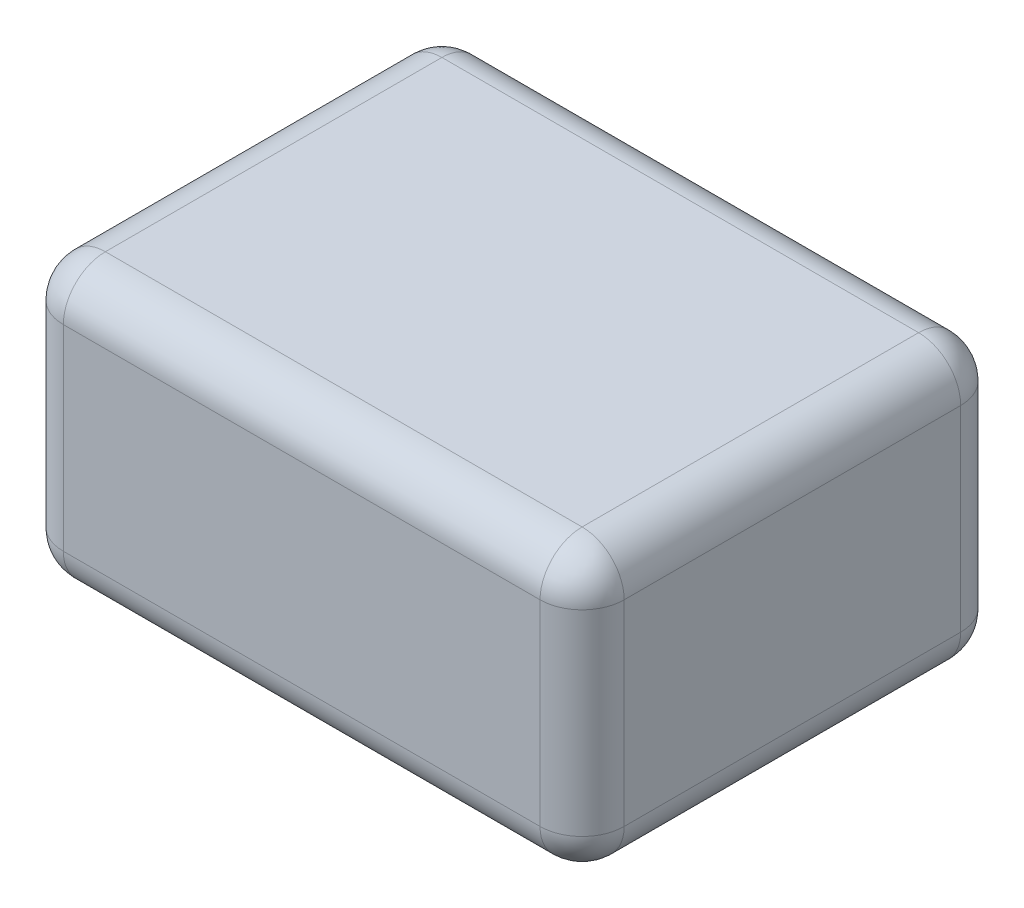
ISO-10303-21;
HEADER;
FILE_DESCRIPTION(('STEP AP214'),'2;1');
FILE_NAME('part.step','',(''),(''),'','','');
FILE_SCHEMA(('AUTOMOTIVE_DESIGN { 1 0 10303 214 1 1 1 1 }'));
ENDSEC;
DATA;
#1=APPLICATION_CONTEXT('core data for automotive mechanical design processes');
#2=APPLICATION_PROTOCOL_DEFINITION('international standard','automotive_design',2000,#1);
#3=PRODUCT_CONTEXT('',#1,'mechanical');
#4=PRODUCT('Part','Part','',(#3));
#5=PRODUCT_RELATED_PRODUCT_CATEGORY('part','',(#4));
#6=PRODUCT_DEFINITION_FORMATION('','',#4);
#7=PRODUCT_DEFINITION_CONTEXT('part definition',#1,'design');
#8=PRODUCT_DEFINITION('design','',#6,#7);
#9=PRODUCT_DEFINITION_SHAPE('','',#8);
#10=(LENGTH_UNIT() NAMED_UNIT(*) SI_UNIT(.MILLI.,.METRE.));
#11=(NAMED_UNIT(*) PLANE_ANGLE_UNIT() SI_UNIT($,.RADIAN.));
#12=(NAMED_UNIT(*) SI_UNIT($,.STERADIAN.) SOLID_ANGLE_UNIT());
#13=UNCERTAINTY_MEASURE_WITH_UNIT(LENGTH_MEASURE(1.E-05),#10,'distance_accuracy_value','');
#14=(GEOMETRIC_REPRESENTATION_CONTEXT(3) GLOBAL_UNCERTAINTY_ASSIGNED_CONTEXT((#13)) GLOBAL_UNIT_ASSIGNED_CONTEXT((#10,
#11,#12)) REPRESENTATION_CONTEXT('',''));
#15=CARTESIAN_POINT('',(0.,0.,0.));
#16=DIRECTION('',(0.,0.,1.));
#17=DIRECTION('',(1.,0.,0.));
#18=AXIS2_PLACEMENT_3D('',#15,#16,#17);
#19=CARTESIAN_POINT('',(-20.,20.,-15.));
#20=DIRECTION('',(1.,0.,0.));
#21=DIRECTION('',(0.,0.,-1.));
#22=AXIS2_PLACEMENT_3D('',#19,#20,#21);
#23=PLANE('',#22);
#24=DIRECTION('',(0.,0.,1.));
#25=VECTOR('',#24,1.);
#26=CARTESIAN_POINT('',(-20.,17.,-15.));
#27=LINE('',#26,#25);
#28=CARTESIAN_POINT('',(-20.,17.,12.));
#29=VERTEX_POINT('',#28);
#30=CARTESIAN_POINT('',(-20.,17.,-12.));
#31=VERTEX_POINT('',#30);
#32=EDGE_CURVE('E161',#29,#31,#27,.F.);
#33=ORIENTED_EDGE('',*,*,#32,.T.);
#34=DIRECTION('',(0.,-1.,0.));
#35=VECTOR('',#34,1.);
#36=CARTESIAN_POINT('',(-20.,20.,-12.));
#37=LINE('',#36,#35);
#38=CARTESIAN_POINT('',(-20.,3.,-12.));
#39=VERTEX_POINT('',#38);
#40=EDGE_CURVE('E164',#31,#39,#37,.T.);
#41=ORIENTED_EDGE('',*,*,#40,.T.);
#42=DIRECTION('',(0.,0.,1.));
#43=VECTOR('',#42,1.);
#44=CARTESIAN_POINT('',(-20.,3.,-15.));
#45=LINE('',#44,#43);
#46=CARTESIAN_POINT('',(-20.,3.,12.));
#47=VERTEX_POINT('',#46);
#48=EDGE_CURVE('E138',#39,#47,#45,.T.);
#49=ORIENTED_EDGE('',*,*,#48,.T.);
#50=DIRECTION('',(0.,-1.,0.));
#51=VECTOR('',#50,1.);
#52=CARTESIAN_POINT('',(-20.,20.,12.));
#53=LINE('',#52,#51);
#54=EDGE_CURVE('E156',#47,#29,#53,.F.);
#55=ORIENTED_EDGE('',*,*,#54,.T.);
#56=EDGE_LOOP('',(#33,#41,#49,#55));
#57=FACE_BOUND('',#56,.T.);
#58=ADVANCED_FACE('F41',(#57),#23,.F.);
#59=CARTESIAN_POINT('',(-20.,20.,15.));
#60=DIRECTION('',(0.,0.,-1.));
#61=DIRECTION('',(-1.,0.,0.));
#62=AXIS2_PLACEMENT_3D('',#59,#60,#61);
#63=PLANE('',#62);
#64=DIRECTION('',(1.,0.,0.));
#65=VECTOR('',#64,1.);
#66=CARTESIAN_POINT('',(-20.,3.,15.));
#67=LINE('',#66,#65);
#68=CARTESIAN_POINT('',(-17.,3.,15.));
#69=VERTEX_POINT('',#68);
#70=CARTESIAN_POINT('',(17.,3.,15.));
#71=VERTEX_POINT('',#70);
#72=EDGE_CURVE('E181',#69,#71,#67,.T.);
#73=ORIENTED_EDGE('',*,*,#72,.T.);
#74=DIRECTION('',(0.,-1.,0.));
#75=VECTOR('',#74,1.);
#76=CARTESIAN_POINT('',(17.,20.,15.));
#77=LINE('',#76,#75);
#78=CARTESIAN_POINT('',(17.,17.,15.));
#79=VERTEX_POINT('',#78);
#80=EDGE_CURVE('E184',#71,#79,#77,.F.);
#81=ORIENTED_EDGE('',*,*,#80,.T.);
#82=DIRECTION('',(1.,0.,0.));
#83=VECTOR('',#82,1.);
#84=CARTESIAN_POINT('',(-20.,17.,15.));
#85=LINE('',#84,#83);
#86=CARTESIAN_POINT('',(-17.,17.,15.));
#87=VERTEX_POINT('',#86);
#88=EDGE_CURVE('E179',#79,#87,#85,.F.);
#89=ORIENTED_EDGE('',*,*,#88,.T.);
#90=DIRECTION('',(0.,-1.,0.));
#91=VECTOR('',#90,1.);
#92=CARTESIAN_POINT('',(-17.,20.,15.));
#93=LINE('',#92,#91);
#94=EDGE_CURVE('E177',#87,#69,#93,.T.);
#95=ORIENTED_EDGE('',*,*,#94,.T.);
#96=EDGE_LOOP('',(#73,#81,#89,#95));
#97=FACE_BOUND('',#96,.T.);
#98=ADVANCED_FACE('F331',(#97),#63,.F.);
#99=CARTESIAN_POINT('',(20.,20.,15.));
#100=DIRECTION('',(-1.,0.,0.));
#101=DIRECTION('',(0.,0.,1.));
#102=AXIS2_PLACEMENT_3D('',#99,#100,#101);
#103=PLANE('',#102);
#104=DIRECTION('',(0.,0.,-1.));
#105=VECTOR('',#104,1.);
#106=CARTESIAN_POINT('',(20.,3.,15.));
#107=LINE('',#106,#105);
#108=CARTESIAN_POINT('',(20.,3.,12.));
#109=VERTEX_POINT('',#108);
#110=CARTESIAN_POINT('',(20.,3.,-12.));
#111=VERTEX_POINT('',#110);
#112=EDGE_CURVE('E190',#109,#111,#107,.T.);
#113=ORIENTED_EDGE('',*,*,#112,.T.);
#114=DIRECTION('',(0.,-1.,0.));
#115=VECTOR('',#114,1.);
#116=CARTESIAN_POINT('',(20.,20.,-12.));
#117=LINE('',#116,#115);
#118=CARTESIAN_POINT('',(20.,17.,-12.));
#119=VERTEX_POINT('',#118);
#120=EDGE_CURVE('E193',#111,#119,#117,.F.);
#121=ORIENTED_EDGE('',*,*,#120,.T.);
#122=DIRECTION('',(0.,0.,-1.));
#123=VECTOR('',#122,1.);
#124=CARTESIAN_POINT('',(20.,17.,15.));
#125=LINE('',#124,#123);
#126=CARTESIAN_POINT('',(20.,17.,12.));
#127=VERTEX_POINT('',#126);
#128=EDGE_CURVE('E188',#119,#127,#125,.F.);
#129=ORIENTED_EDGE('',*,*,#128,.T.);
#130=DIRECTION('',(0.,-1.,0.));
#131=VECTOR('',#130,1.);
#132=CARTESIAN_POINT('',(20.,20.,12.));
#133=LINE('',#132,#131);
#134=EDGE_CURVE('E186',#127,#109,#133,.T.);
#135=ORIENTED_EDGE('',*,*,#134,.T.);
#136=EDGE_LOOP('',(#113,#121,#129,#135));
#137=FACE_BOUND('',#136,.T.);
#138=ADVANCED_FACE('F301',(#137),#103,.F.);
#139=CARTESIAN_POINT('',(20.,20.,-15.));
#140=DIRECTION('',(0.,0.,1.));
#141=DIRECTION('',(1.,0.,0.));
#142=AXIS2_PLACEMENT_3D('',#139,#140,#141);
#143=PLANE('',#142);
#144=DIRECTION('',(-1.,0.,0.));
#145=VECTOR('',#144,1.);
#146=CARTESIAN_POINT('',(20.,3.,-15.));
#147=LINE('',#146,#145);
#148=CARTESIAN_POINT('',(17.,3.,-15.));
#149=VERTEX_POINT('',#148);
#150=CARTESIAN_POINT('',(-17.,3.,-15.));
#151=VERTEX_POINT('',#150);
#152=EDGE_CURVE('E199',#149,#151,#147,.T.);
#153=ORIENTED_EDGE('',*,*,#152,.T.);
#154=DIRECTION('',(0.,-1.,0.));
#155=VECTOR('',#154,1.);
#156=CARTESIAN_POINT('',(-17.,20.,-15.));
#157=LINE('',#156,#155);
#158=CARTESIAN_POINT('',(-17.,17.,-15.));
#159=VERTEX_POINT('',#158);
#160=EDGE_CURVE('E202',#151,#159,#157,.F.);
#161=ORIENTED_EDGE('',*,*,#160,.T.);
#162=DIRECTION('',(-1.,0.,0.));
#163=VECTOR('',#162,1.);
#164=CARTESIAN_POINT('',(20.,17.,-15.));
#165=LINE('',#164,#163);
#166=CARTESIAN_POINT('',(17.,17.,-15.));
#167=VERTEX_POINT('',#166);
#168=EDGE_CURVE('E197',#159,#167,#165,.F.);
#169=ORIENTED_EDGE('',*,*,#168,.T.);
#170=DIRECTION('',(0.,-1.,0.));
#171=VECTOR('',#170,1.);
#172=CARTESIAN_POINT('',(17.,20.,-15.));
#173=LINE('',#172,#171);
#174=EDGE_CURVE('E195',#167,#149,#173,.T.);
#175=ORIENTED_EDGE('',*,*,#174,.T.);
#176=EDGE_LOOP('',(#153,#161,#169,#175));
#177=FACE_BOUND('',#176,.T.);
#178=ADVANCED_FACE('F277',(#177),#143,.F.);
#179=CARTESIAN_POINT('',(0.,20.,0.));
#180=DIRECTION('',(0.,1.,0.));
#181=DIRECTION('',(0.,0.,1.));
#182=AXIS2_PLACEMENT_3D('',#179,#180,#181);
#183=PLANE('',#182);
#184=DIRECTION('',(-1.,0.,0.));
#185=VECTOR('',#184,1.);
#186=CARTESIAN_POINT('',(-20.,20.,-12.));
#187=LINE('',#186,#185);
#188=CARTESIAN_POINT('',(17.,20.,-12.));
#189=VERTEX_POINT('',#188);
#190=CARTESIAN_POINT('',(-17.,20.,-12.));
#191=VERTEX_POINT('',#190);
#192=EDGE_CURVE('E204',#189,#191,#187,.T.);
#193=ORIENTED_EDGE('',*,*,#192,.T.);
#194=DIRECTION('',(0.,0.,1.));
#195=VECTOR('',#194,1.);
#196=CARTESIAN_POINT('',(-17.,20.,15.));
#197=LINE('',#196,#195);
#198=CARTESIAN_POINT('',(-17.,20.,12.));
#199=VERTEX_POINT('',#198);
#200=EDGE_CURVE('E11',#191,#199,#197,.T.);
#201=ORIENTED_EDGE('',*,*,#200,.T.);
#202=DIRECTION('',(1.,0.,0.));
#203=VECTOR('',#202,1.);
#204=CARTESIAN_POINT('',(20.,20.,12.));
#205=LINE('',#204,#203);
#206=CARTESIAN_POINT('',(17.,20.,12.));
#207=VERTEX_POINT('',#206);
#208=EDGE_CURVE('E50',#199,#207,#205,.T.);
#209=ORIENTED_EDGE('',*,*,#208,.T.);
#210=DIRECTION('',(0.,0.,-1.));
#211=VECTOR('',#210,1.);
#212=CARTESIAN_POINT('',(17.,20.,-15.));
#213=LINE('',#212,#211);
#214=EDGE_CURVE('E206',#207,#189,#213,.T.);
#215=ORIENTED_EDGE('',*,*,#214,.T.);
#216=EDGE_LOOP('',(#193,#201,#209,#215));
#217=FACE_BOUND('',#216,.T.);
#218=ADVANCED_FACE('F285',(#217),#183,.T.);
#219=CARTESIAN_POINT('',(0.,0.,0.));
#220=DIRECTION('',(0.,1.,0.));
#221=DIRECTION('',(0.,0.,1.));
#222=AXIS2_PLACEMENT_3D('',#219,#220,#221);
#223=PLANE('',#222);
#224=DIRECTION('',(1.,0.,0.));
#225=VECTOR('',#224,1.);
#226=CARTESIAN_POINT('',(0.,0.,12.));
#227=LINE('',#226,#225);
#228=CARTESIAN_POINT('',(17.,0.,12.));
#229=VERTEX_POINT('',#228);
#230=CARTESIAN_POINT('',(-17.,0.,12.));
#231=VERTEX_POINT('',#230);
#232=EDGE_CURVE('E174',#229,#231,#227,.F.);
#233=ORIENTED_EDGE('',*,*,#232,.T.);
#234=DIRECTION('',(0.,0.,1.));
#235=VECTOR('',#234,1.);
#236=CARTESIAN_POINT('',(-17.,0.,0.));
#237=LINE('',#236,#235);
#238=CARTESIAN_POINT('',(-17.,0.,-12.));
#239=VERTEX_POINT('',#238);
#240=EDGE_CURVE('E140',#231,#239,#237,.F.);
#241=ORIENTED_EDGE('',*,*,#240,.T.);
#242=DIRECTION('',(-1.,0.,0.));
#243=VECTOR('',#242,1.);
#244=CARTESIAN_POINT('',(0.,0.,-12.));
#245=LINE('',#244,#243);
#246=CARTESIAN_POINT('',(17.,0.,-12.));
#247=VERTEX_POINT('',#246);
#248=EDGE_CURVE('E167',#239,#247,#245,.F.);
#249=ORIENTED_EDGE('',*,*,#248,.T.);
#250=DIRECTION('',(0.,0.,-1.));
#251=VECTOR('',#250,1.);
#252=CARTESIAN_POINT('',(17.,0.,0.));
#253=LINE('',#252,#251);
#254=EDGE_CURVE('E172',#247,#229,#253,.F.);
#255=ORIENTED_EDGE('',*,*,#254,.T.);
#256=EDGE_LOOP('',(#233,#241,#249,#255));
#257=FACE_BOUND('',#256,.T.);
#258=ADVANCED_FACE('F364',(#257),#223,.F.);
#259=CARTESIAN_POINT('',(17.,17.,0.));
#260=DIRECTION('',(0.,0.,1.));
#261=DIRECTION('',(1.,0.,0.));
#262=AXIS2_PLACEMENT_3D('',#259,#260,#261);
#263=CYLINDRICAL_SURFACE('',#262,3.);
#264=CARTESIAN_POINT('',(17.,17.,-12.));
#265=DIRECTION('',(0.,0.,-1.));
#266=DIRECTION('',(-1.,0.,0.));
#267=AXIS2_PLACEMENT_3D('',#264,#265,#266);
#268=CIRCLE('',#267,3.);
#269=EDGE_CURVE('E45',#189,#119,#268,.T.);
#270=ORIENTED_EDGE('',*,*,#269,.F.);
#271=ORIENTED_EDGE('',*,*,#214,.F.);
#272=CARTESIAN_POINT('',(17.,17.,12.));
#273=DIRECTION('',(0.,0.,1.));
#274=DIRECTION('',(1.,0.,0.));
#275=AXIS2_PLACEMENT_3D('',#272,#273,#274);
#276=CIRCLE('',#275,3.);
#277=EDGE_CURVE('E255',#127,#207,#276,.T.);
#278=ORIENTED_EDGE('',*,*,#277,.F.);
#279=ORIENTED_EDGE('',*,*,#128,.F.);
#280=EDGE_LOOP('',(#270,#271,#278,#279));
#281=FACE_BOUND('',#280,.T.);
#282=ADVANCED_FACE('F43',(#281),#263,.T.);
#283=CARTESIAN_POINT('',(17.,17.,-12.));
#284=DIRECTION('',(1.,0.,0.));
#285=DIRECTION('',(0.,0.,-1.));
#286=AXIS2_PLACEMENT_3D('',#283,#284,#285);
#287=SPHERICAL_SURFACE('',#286,3.);
#288=CARTESIAN_POINT('',(17.,17.,-12.));
#289=DIRECTION('',(1.,0.,0.));
#290=DIRECTION('',(0.,0.,-1.));
#291=AXIS2_PLACEMENT_3D('',#288,#289,#290);
#292=CIRCLE('',#291,3.);
#293=EDGE_CURVE('E250',#189,#167,#292,.F.);
#294=ORIENTED_EDGE('',*,*,#293,.F.);
#295=ORIENTED_EDGE('',*,*,#269,.T.);
#296=CARTESIAN_POINT('',(17.,17.,-12.));
#297=DIRECTION('',(0.,1.,0.));
#298=DIRECTION('',(0.,0.,1.));
#299=AXIS2_PLACEMENT_3D('',#296,#297,#298);
#300=CIRCLE('',#299,3.);
#301=EDGE_CURVE('E253',#167,#119,#300,.F.);
#302=ORIENTED_EDGE('',*,*,#301,.F.);
#303=EDGE_LOOP('',(#294,#295,#302));
#304=FACE_BOUND('',#303,.T.);
#305=ADVANCED_FACE('F266',(#304),#287,.T.);
#306=CARTESIAN_POINT('',(17.,17.,12.));
#307=DIRECTION('',(0.,1.,0.));
#308=DIRECTION('',(0.,0.,1.));
#309=AXIS2_PLACEMENT_3D('',#306,#307,#308);
#310=SPHERICAL_SURFACE('',#309,3.);
#311=CARTESIAN_POINT('',(17.,17.,12.));
#312=DIRECTION('',(0.,1.,0.));
#313=DIRECTION('',(0.,0.,1.));
#314=AXIS2_PLACEMENT_3D('',#311,#312,#313);
#315=CIRCLE('',#314,3.);
#316=EDGE_CURVE('E244',#127,#79,#315,.F.);
#317=ORIENTED_EDGE('',*,*,#316,.F.);
#318=ORIENTED_EDGE('',*,*,#277,.T.);
#319=CARTESIAN_POINT('',(17.,17.,12.));
#320=DIRECTION('',(1.,0.,0.));
#321=DIRECTION('',(0.,0.,-1.));
#322=AXIS2_PLACEMENT_3D('',#319,#320,#321);
#323=CIRCLE('',#322,3.);
#324=EDGE_CURVE('E247',#79,#207,#323,.F.);
#325=ORIENTED_EDGE('',*,*,#324,.F.);
#326=EDGE_LOOP('',(#317,#318,#325));
#327=FACE_BOUND('',#326,.T.);
#328=ADVANCED_FACE('F293',(#327),#310,.T.);
#329=CARTESIAN_POINT('',(17.,20.,-12.));
#330=DIRECTION('',(0.,-1.,0.));
#331=DIRECTION('',(0.,0.,-1.));
#332=AXIS2_PLACEMENT_3D('',#329,#330,#331);
#333=CYLINDRICAL_SURFACE('',#332,3.);
#334=ORIENTED_EDGE('',*,*,#301,.T.);
#335=ORIENTED_EDGE('',*,*,#120,.F.);
#336=CARTESIAN_POINT('',(17.,3.,-12.));
#337=DIRECTION('',(0.,-1.,0.));
#338=DIRECTION('',(0.,0.,-1.));
#339=AXIS2_PLACEMENT_3D('',#336,#337,#338);
#340=CIRCLE('',#339,3.);
#341=EDGE_CURVE('E239',#149,#111,#340,.T.);
#342=ORIENTED_EDGE('',*,*,#341,.F.);
#343=ORIENTED_EDGE('',*,*,#174,.F.);
#344=EDGE_LOOP('',(#334,#335,#342,#343));
#345=FACE_BOUND('',#344,.T.);
#346=ADVANCED_FACE('F273',(#345),#333,.T.);
#347=CARTESIAN_POINT('',(0.,17.,-12.));
#348=DIRECTION('',(1.,0.,0.));
#349=DIRECTION('',(0.,0.,-1.));
#350=AXIS2_PLACEMENT_3D('',#347,#348,#349);
#351=CYLINDRICAL_SURFACE('',#350,3.);
#352=ORIENTED_EDGE('',*,*,#293,.T.);
#353=ORIENTED_EDGE('',*,*,#168,.F.);
#354=CARTESIAN_POINT('',(-17.,17.,-12.));
#355=DIRECTION('',(-1.,0.,0.));
#356=DIRECTION('',(0.,0.,1.));
#357=AXIS2_PLACEMENT_3D('',#354,#355,#356);
#358=CIRCLE('',#357,3.);
#359=EDGE_CURVE('E236',#191,#159,#358,.T.);
#360=ORIENTED_EDGE('',*,*,#359,.F.);
#361=ORIENTED_EDGE('',*,*,#192,.F.);
#362=EDGE_LOOP('',(#352,#353,#360,#361));
#363=FACE_BOUND('',#362,.T.);
#364=ADVANCED_FACE('F283',(#363),#351,.T.);
#365=CARTESIAN_POINT('',(-17.,17.,0.));
#366=DIRECTION('',(0.,0.,-1.));
#367=DIRECTION('',(-1.,0.,0.));
#368=AXIS2_PLACEMENT_3D('',#365,#366,#367);
#369=CYLINDRICAL_SURFACE('',#368,3.);
#370=CARTESIAN_POINT('',(-17.,17.,12.));
#371=DIRECTION('',(0.,0.,1.));
#372=DIRECTION('',(1.,0.,0.));
#373=AXIS2_PLACEMENT_3D('',#370,#371,#372);
#374=CIRCLE('',#373,3.);
#375=EDGE_CURVE('E231',#199,#29,#374,.T.);
#376=ORIENTED_EDGE('',*,*,#375,.F.);
#377=ORIENTED_EDGE('',*,*,#200,.F.);
#378=CARTESIAN_POINT('',(-17.,17.,-12.));
#379=DIRECTION('',(0.,0.,-1.));
#380=DIRECTION('',(-1.,0.,0.));
#381=AXIS2_PLACEMENT_3D('',#378,#379,#380);
#382=CIRCLE('',#381,3.);
#383=EDGE_CURVE('E233',#31,#191,#382,.T.);
#384=ORIENTED_EDGE('',*,*,#383,.F.);
#385=ORIENTED_EDGE('',*,*,#32,.F.);
#386=EDGE_LOOP('',(#376,#377,#384,#385));
#387=FACE_BOUND('',#386,.T.);
#388=ADVANCED_FACE('F288',(#387),#369,.T.);
#389=CARTESIAN_POINT('',(0.,17.,12.));
#390=DIRECTION('',(-1.,0.,0.));
#391=DIRECTION('',(0.,0.,1.));
#392=AXIS2_PLACEMENT_3D('',#389,#390,#391);
#393=CYLINDRICAL_SURFACE('',#392,3.);
#394=ORIENTED_EDGE('',*,*,#324,.T.);
#395=ORIENTED_EDGE('',*,*,#208,.F.);
#396=CARTESIAN_POINT('',(-17.,17.,12.));
#397=DIRECTION('',(-1.,0.,0.));
#398=DIRECTION('',(0.,0.,1.));
#399=AXIS2_PLACEMENT_3D('',#396,#397,#398);
#400=CIRCLE('',#399,3.);
#401=EDGE_CURVE('E58',#87,#199,#400,.T.);
#402=ORIENTED_EDGE('',*,*,#401,.F.);
#403=ORIENTED_EDGE('',*,*,#88,.F.);
#404=EDGE_LOOP('',(#394,#395,#402,#403));
#405=FACE_BOUND('',#404,.T.);
#406=ADVANCED_FACE('F291',(#405),#393,.T.);
#407=CARTESIAN_POINT('',(17.,20.,12.));
#408=DIRECTION('',(0.,-1.,0.));
#409=DIRECTION('',(0.,0.,-1.));
#410=AXIS2_PLACEMENT_3D('',#407,#408,#409);
#411=CYLINDRICAL_SURFACE('',#410,3.);
#412=ORIENTED_EDGE('',*,*,#316,.T.);
#413=ORIENTED_EDGE('',*,*,#80,.F.);
#414=CARTESIAN_POINT('',(17.,3.,12.));
#415=DIRECTION('',(0.,-1.,0.));
#416=DIRECTION('',(0.,0.,-1.));
#417=AXIS2_PLACEMENT_3D('',#414,#415,#416);
#418=CIRCLE('',#417,3.);
#419=EDGE_CURVE('E227',#109,#71,#418,.T.);
#420=ORIENTED_EDGE('',*,*,#419,.F.);
#421=ORIENTED_EDGE('',*,*,#134,.F.);
#422=EDGE_LOOP('',(#412,#413,#420,#421));
#423=FACE_BOUND('',#422,.T.);
#424=ADVANCED_FACE('F298',(#423),#411,.T.);
#425=CARTESIAN_POINT('',(17.,3.,15.));
#426=DIRECTION('',(0.,0.,-1.));
#427=DIRECTION('',(-1.,0.,0.));
#428=AXIS2_PLACEMENT_3D('',#425,#426,#427);
#429=CYLINDRICAL_SURFACE('',#428,3.);
#430=CARTESIAN_POINT('',(17.,3.,-12.));
#431=DIRECTION('',(0.,0.,-1.));
#432=DIRECTION('',(-1.,0.,0.));
#433=AXIS2_PLACEMENT_3D('',#430,#431,#432);
#434=CIRCLE('',#433,3.);
#435=EDGE_CURVE('E241',#111,#247,#434,.T.);
#436=ORIENTED_EDGE('',*,*,#435,.F.);
#437=ORIENTED_EDGE('',*,*,#112,.F.);
#438=CARTESIAN_POINT('',(17.,3.,12.));
#439=DIRECTION('',(0.,0.,1.));
#440=DIRECTION('',(1.,0.,0.));
#441=AXIS2_PLACEMENT_3D('',#438,#439,#440);
#442=CIRCLE('',#441,3.);
#443=EDGE_CURVE('E224',#229,#109,#442,.T.);
#444=ORIENTED_EDGE('',*,*,#443,.F.);
#445=ORIENTED_EDGE('',*,*,#254,.F.);
#446=EDGE_LOOP('',(#436,#437,#444,#445));
#447=FACE_BOUND('',#446,.T.);
#448=ADVANCED_FACE('F305',(#447),#429,.T.);
#449=CARTESIAN_POINT('',(17.,3.,-12.));
#450=DIRECTION('',(1.,0.,0.));
#451=DIRECTION('',(0.,1.,0.));
#452=AXIS2_PLACEMENT_3D('',#449,#450,#451);
#453=SPHERICAL_SURFACE('',#452,3.);
#454=ORIENTED_EDGE('',*,*,#341,.T.);
#455=ORIENTED_EDGE('',*,*,#435,.T.);
#456=CARTESIAN_POINT('',(17.,3.,-12.));
#457=DIRECTION('',(1.,0.,0.));
#458=DIRECTION('',(0.,0.,-1.));
#459=AXIS2_PLACEMENT_3D('',#456,#457,#458);
#460=CIRCLE('',#459,3.);
#461=EDGE_CURVE('E221',#149,#247,#460,.F.);
#462=ORIENTED_EDGE('',*,*,#461,.F.);
#463=EDGE_LOOP('',(#454,#455,#462));
#464=FACE_BOUND('',#463,.T.);
#465=ADVANCED_FACE('F309',(#464),#453,.T.);
#466=CARTESIAN_POINT('',(-17.,17.,-12.));
#467=DIRECTION('',(0.,1.,0.));
#468=DIRECTION('',(0.,0.,1.));
#469=AXIS2_PLACEMENT_3D('',#466,#467,#468);
#470=SPHERICAL_SURFACE('',#469,3.);
#471=ORIENTED_EDGE('',*,*,#383,.T.);
#472=ORIENTED_EDGE('',*,*,#359,.T.);
#473=CARTESIAN_POINT('',(-17.,17.,-12.));
#474=DIRECTION('',(0.,1.,0.));
#475=DIRECTION('',(0.,0.,1.));
#476=AXIS2_PLACEMENT_3D('',#473,#474,#475);
#477=CIRCLE('',#476,3.);
#478=EDGE_CURVE('E218',#31,#159,#477,.F.);
#479=ORIENTED_EDGE('',*,*,#478,.F.);
#480=EDGE_LOOP('',(#471,#472,#479));
#481=FACE_BOUND('',#480,.T.);
#482=ADVANCED_FACE('F319',(#481),#470,.T.);
#483=CARTESIAN_POINT('',(-17.,17.,12.));
#484=DIRECTION('',(0.,1.,0.));
#485=DIRECTION('',(0.,0.,1.));
#486=AXIS2_PLACEMENT_3D('',#483,#484,#485);
#487=SPHERICAL_SURFACE('',#486,3.);
#488=ORIENTED_EDGE('',*,*,#401,.T.);
#489=ORIENTED_EDGE('',*,*,#375,.T.);
#490=CARTESIAN_POINT('',(-17.,17.,12.));
#491=DIRECTION('',(0.,1.,0.));
#492=DIRECTION('',(0.,0.,1.));
#493=AXIS2_PLACEMENT_3D('',#490,#491,#492);
#494=CIRCLE('',#493,3.);
#495=EDGE_CURVE('E158',#87,#29,#494,.F.);
#496=ORIENTED_EDGE('',*,*,#495,.F.);
#497=EDGE_LOOP('',(#488,#489,#496));
#498=FACE_BOUND('',#497,.T.);
#499=ADVANCED_FACE('F321',(#498),#487,.T.);
#500=CARTESIAN_POINT('',(17.,3.,12.));
#501=DIRECTION('',(1.,0.,0.));
#502=DIRECTION('',(0.,1.,0.));
#503=AXIS2_PLACEMENT_3D('',#500,#501,#502);
#504=SPHERICAL_SURFACE('',#503,3.);
#505=ORIENTED_EDGE('',*,*,#443,.T.);
#506=ORIENTED_EDGE('',*,*,#419,.T.);
#507=CARTESIAN_POINT('',(17.,3.,12.));
#508=DIRECTION('',(1.,0.,0.));
#509=DIRECTION('',(0.,0.,-1.));
#510=AXIS2_PLACEMENT_3D('',#507,#508,#509);
#511=CIRCLE('',#510,3.);
#512=EDGE_CURVE('E215',#229,#71,#511,.F.);
#513=ORIENTED_EDGE('',*,*,#512,.F.);
#514=EDGE_LOOP('',(#505,#506,#513));
#515=FACE_BOUND('',#514,.T.);
#516=ADVANCED_FACE('F327',(#515),#504,.T.);
#517=CARTESIAN_POINT('',(20.,3.,-12.));
#518=DIRECTION('',(-1.,0.,0.));
#519=DIRECTION('',(0.,0.,1.));
#520=AXIS2_PLACEMENT_3D('',#517,#518,#519);
#521=CYLINDRICAL_SURFACE('',#520,3.);
#522=ORIENTED_EDGE('',*,*,#461,.T.);
#523=ORIENTED_EDGE('',*,*,#248,.F.);
#524=CARTESIAN_POINT('',(-17.,3.,-12.));
#525=DIRECTION('',(-1.,0.,0.));
#526=DIRECTION('',(0.,0.,1.));
#527=AXIS2_PLACEMENT_3D('',#524,#525,#526);
#528=CIRCLE('',#527,3.);
#529=EDGE_CURVE('E212',#151,#239,#528,.T.);
#530=ORIENTED_EDGE('',*,*,#529,.F.);
#531=ORIENTED_EDGE('',*,*,#152,.F.);
#532=EDGE_LOOP('',(#522,#523,#530,#531));
#533=FACE_BOUND('',#532,.T.);
#534=ADVANCED_FACE('F312',(#533),#521,.T.);
#535=CARTESIAN_POINT('',(-17.,20.,-12.));
#536=DIRECTION('',(0.,-1.,0.));
#537=DIRECTION('',(0.,0.,-1.));
#538=AXIS2_PLACEMENT_3D('',#535,#536,#537);
#539=CYLINDRICAL_SURFACE('',#538,3.);
#540=ORIENTED_EDGE('',*,*,#478,.T.);
#541=ORIENTED_EDGE('',*,*,#160,.F.);
#542=CARTESIAN_POINT('',(-17.,3.,-12.));
#543=DIRECTION('',(0.,-1.,0.));
#544=DIRECTION('',(0.,0.,-1.));
#545=AXIS2_PLACEMENT_3D('',#542,#543,#544);
#546=CIRCLE('',#545,3.);
#547=EDGE_CURVE('E153',#39,#151,#546,.T.);
#548=ORIENTED_EDGE('',*,*,#547,.F.);
#549=ORIENTED_EDGE('',*,*,#40,.F.);
#550=EDGE_LOOP('',(#540,#541,#548,#549));
#551=FACE_BOUND('',#550,.T.);
#552=ADVANCED_FACE('F317',(#551),#539,.T.);
#553=CARTESIAN_POINT('',(-17.,20.,12.));
#554=DIRECTION('',(0.,-1.,0.));
#555=DIRECTION('',(0.,0.,-1.));
#556=AXIS2_PLACEMENT_3D('',#553,#554,#555);
#557=CYLINDRICAL_SURFACE('',#556,3.);
#558=ORIENTED_EDGE('',*,*,#495,.T.);
#559=ORIENTED_EDGE('',*,*,#54,.F.);
#560=CARTESIAN_POINT('',(-17.,3.,12.));
#561=DIRECTION('',(0.,-1.,0.));
#562=DIRECTION('',(0.,0.,-1.));
#563=AXIS2_PLACEMENT_3D('',#560,#561,#562);
#564=CIRCLE('',#563,3.);
#565=EDGE_CURVE('E146',#69,#47,#564,.T.);
#566=ORIENTED_EDGE('',*,*,#565,.F.);
#567=ORIENTED_EDGE('',*,*,#94,.F.);
#568=EDGE_LOOP('',(#558,#559,#566,#567));
#569=FACE_BOUND('',#568,.T.);
#570=ADVANCED_FACE('F157',(#569),#557,.T.);
#571=CARTESIAN_POINT('',(-20.,3.,12.));
#572=DIRECTION('',(1.,0.,0.));
#573=DIRECTION('',(0.,0.,-1.));
#574=AXIS2_PLACEMENT_3D('',#571,#572,#573);
#575=CYLINDRICAL_SURFACE('',#574,3.);
#576=ORIENTED_EDGE('',*,*,#512,.T.);
#577=ORIENTED_EDGE('',*,*,#72,.F.);
#578=CARTESIAN_POINT('',(-17.,3.,12.));
#579=DIRECTION('',(-1.,0.,0.));
#580=DIRECTION('',(0.,0.,1.));
#581=AXIS2_PLACEMENT_3D('',#578,#579,#580);
#582=CIRCLE('',#581,3.);
#583=EDGE_CURVE('E150',#231,#69,#582,.T.);
#584=ORIENTED_EDGE('',*,*,#583,.F.);
#585=ORIENTED_EDGE('',*,*,#232,.F.);
#586=EDGE_LOOP('',(#576,#577,#584,#585));
#587=FACE_BOUND('',#586,.T.);
#588=ADVANCED_FACE('F347',(#587),#575,.T.);
#589=CARTESIAN_POINT('',(-17.,3.,-12.));
#590=DIRECTION('',(0.,0.,-1.));
#591=DIRECTION('',(0.,1.,0.));
#592=AXIS2_PLACEMENT_3D('',#589,#590,#591);
#593=SPHERICAL_SURFACE('',#592,3.);
#594=ORIENTED_EDGE('',*,*,#547,.T.);
#595=ORIENTED_EDGE('',*,*,#529,.T.);
#596=CARTESIAN_POINT('',(-17.,3.,-12.));
#597=DIRECTION('',(0.,0.,-1.));
#598=DIRECTION('',(-1.,0.,0.));
#599=AXIS2_PLACEMENT_3D('',#596,#597,#598);
#600=CIRCLE('',#599,3.);
#601=EDGE_CURVE('E143',#39,#239,#600,.F.);
#602=ORIENTED_EDGE('',*,*,#601,.F.);
#603=EDGE_LOOP('',(#594,#595,#602));
#604=FACE_BOUND('',#603,.T.);
#605=ADVANCED_FACE('F344',(#604),#593,.T.);
#606=CARTESIAN_POINT('',(-17.,3.,12.));
#607=DIRECTION('',(0.,0.,1.));
#608=DIRECTION('',(0.,-1.,0.));
#609=AXIS2_PLACEMENT_3D('',#606,#607,#608);
#610=SPHERICAL_SURFACE('',#609,3.);
#611=ORIENTED_EDGE('',*,*,#583,.T.);
#612=ORIENTED_EDGE('',*,*,#565,.T.);
#613=CARTESIAN_POINT('',(-17.,3.,12.));
#614=DIRECTION('',(0.,0.,1.));
#615=DIRECTION('',(1.,0.,0.));
#616=AXIS2_PLACEMENT_3D('',#613,#614,#615);
#617=CIRCLE('',#616,3.);
#618=EDGE_CURVE('E134',#231,#47,#617,.F.);
#619=ORIENTED_EDGE('',*,*,#618,.F.);
#620=EDGE_LOOP('',(#611,#612,#619));
#621=FACE_BOUND('',#620,.T.);
#622=ADVANCED_FACE('F148',(#621),#610,.T.);
#623=CARTESIAN_POINT('',(-17.,3.,-15.));
#624=DIRECTION('',(0.,0.,1.));
#625=DIRECTION('',(1.,0.,0.));
#626=AXIS2_PLACEMENT_3D('',#623,#624,#625);
#627=CYLINDRICAL_SURFACE('',#626,3.);
#628=ORIENTED_EDGE('',*,*,#601,.T.);
#629=ORIENTED_EDGE('',*,*,#240,.F.);
#630=ORIENTED_EDGE('',*,*,#618,.T.);
#631=ORIENTED_EDGE('',*,*,#48,.F.);
#632=EDGE_LOOP('',(#628,#629,#630,#631));
#633=FACE_BOUND('',#632,.T.);
#634=ADVANCED_FACE('F136',(#633),#627,.T.);
#635=CLOSED_SHELL('',(#58,#98,#138,#178,#218,#258,#282,#305,#328,#346,#364,#388,#406,#424,#448,
#465,#482,#499,#516,#534,#552,#570,#588,#605,#622,#634));
#636=MANIFOLD_SOLID_BREP('B2',#635);
#637=ADVANCED_BREP_SHAPE_REPRESENTATION('',(#18,#636),#14);
#638=SHAPE_DEFINITION_REPRESENTATION(#9,#637);
ENDSEC;
END-ISO-10303-21;
